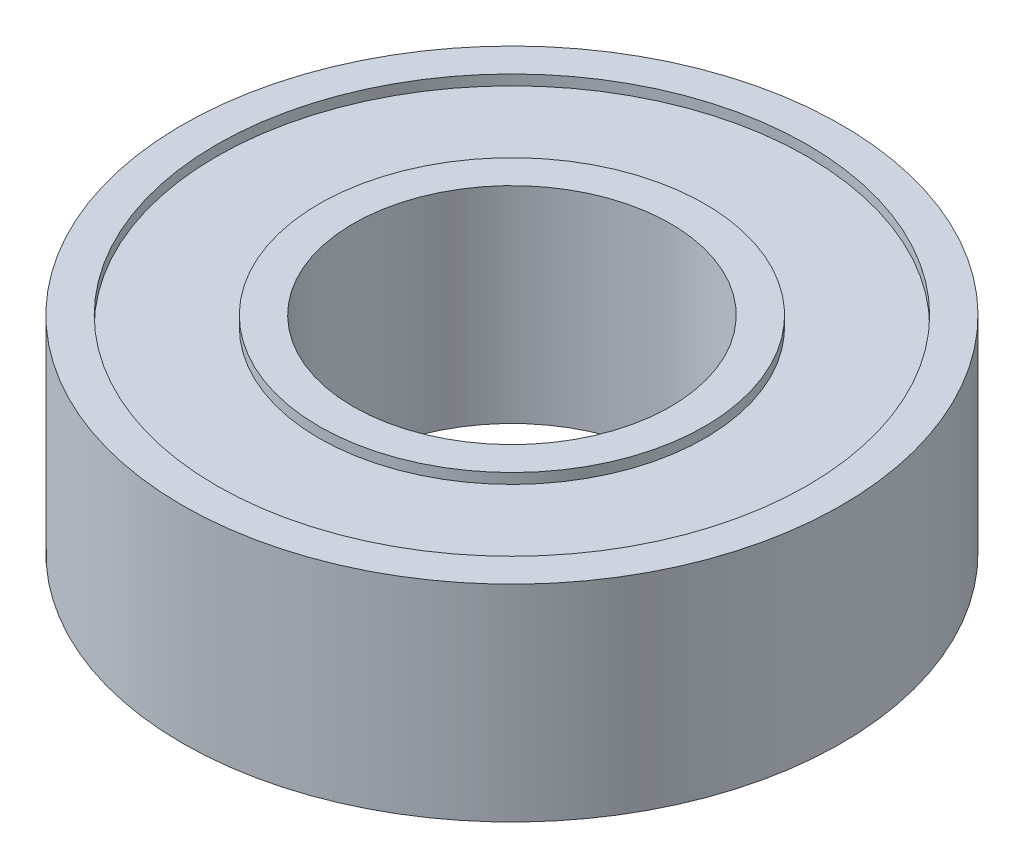
ISO-10303-21;
HEADER;
FILE_DESCRIPTION(('STEP AP214'),'2;1');
FILE_NAME('part.step','',(''),(''),'','','');
FILE_SCHEMA(('AUTOMOTIVE_DESIGN { 1 0 10303 214 1 1 1 1 }'));
ENDSEC;
DATA;
#1=APPLICATION_CONTEXT('core data for automotive mechanical design processes');
#2=APPLICATION_PROTOCOL_DEFINITION('international standard','automotive_design',2000,#1);
#3=PRODUCT_CONTEXT('',#1,'mechanical');
#4=PRODUCT('Part','Part','',(#3));
#5=PRODUCT_RELATED_PRODUCT_CATEGORY('part','',(#4));
#6=PRODUCT_DEFINITION_FORMATION('','',#4);
#7=PRODUCT_DEFINITION_CONTEXT('part definition',#1,'design');
#8=PRODUCT_DEFINITION('design','',#6,#7);
#9=PRODUCT_DEFINITION_SHAPE('','',#8);
#10=(LENGTH_UNIT() NAMED_UNIT(*) SI_UNIT(.MILLI.,.METRE.));
#11=(NAMED_UNIT(*) PLANE_ANGLE_UNIT() SI_UNIT($,.RADIAN.));
#12=(NAMED_UNIT(*) SI_UNIT($,.STERADIAN.) SOLID_ANGLE_UNIT());
#13=UNCERTAINTY_MEASURE_WITH_UNIT(LENGTH_MEASURE(1.E-05),#10,'distance_accuracy_value','');
#14=(GEOMETRIC_REPRESENTATION_CONTEXT(3) GLOBAL_UNCERTAINTY_ASSIGNED_CONTEXT((#13)) GLOBAL_UNIT_ASSIGNED_CONTEXT((#10,
#11,#12)) REPRESENTATION_CONTEXT('',''));
#15=CARTESIAN_POINT('',(0.,0.,0.));
#16=DIRECTION('',(0.,0.,1.));
#17=DIRECTION('',(1.,0.,0.));
#18=AXIS2_PLACEMENT_3D('',#15,#16,#17);
#19=CARTESIAN_POINT('',(0.,-2.5,0.));
#20=DIRECTION('',(0.,1.,0.));
#21=DIRECTION('',(0.,0.,1.));
#22=AXIS2_PLACEMENT_3D('',#19,#20,#21);
#23=PLANE('',#22);
#24=CARTESIAN_POINT('',(0.,-2.5,0.));
#25=DIRECTION('',(0.,1.,0.));
#26=DIRECTION('',(0.,0.,1.));
#27=AXIS2_PLACEMENT_3D('',#24,#25,#26);
#28=CIRCLE('',#27,3.85);
#29=CARTESIAN_POINT('',(0.,-2.5,3.85));
#30=VERTEX_POINT('',#29);
#31=EDGE_CURVE('E48',#30,#30,#28,.T.);
#32=ORIENTED_EDGE('',*,*,#31,.T.);
#33=EDGE_LOOP('',(#32));
#34=FACE_BOUND('',#33,.T.);
#35=CARTESIAN_POINT('',(0.,-2.5,0.));
#36=DIRECTION('',(0.,1.,0.));
#37=DIRECTION('',(0.,0.,1.));
#38=AXIS2_PLACEMENT_3D('',#35,#36,#37);
#39=CIRCLE('',#38,4.68);
#40=CARTESIAN_POINT('',(0.,-2.5,4.68));
#41=VERTEX_POINT('',#40);
#42=EDGE_CURVE('E72',#41,#41,#39,.T.);
#43=ORIENTED_EDGE('',*,*,#42,.F.);
#44=EDGE_LOOP('',(#43));
#45=FACE_BOUND('',#44,.T.);
#46=ADVANCED_FACE('F35',(#34,#45),#23,.F.);
#47=CARTESIAN_POINT('',(0.,2.5,0.));
#48=DIRECTION('',(0.,1.,0.));
#49=DIRECTION('',(0.,0.,1.));
#50=AXIS2_PLACEMENT_3D('',#47,#48,#49);
#51=PLANE('',#50);
#52=CARTESIAN_POINT('',(0.,2.5,0.));
#53=DIRECTION('',(0.,1.,0.));
#54=DIRECTION('',(0.,0.,1.));
#55=AXIS2_PLACEMENT_3D('',#52,#53,#54);
#56=CIRCLE('',#55,3.85);
#57=CARTESIAN_POINT('',(0.,2.5,3.85));
#58=VERTEX_POINT('',#57);
#59=EDGE_CURVE('E46',#58,#58,#56,.T.);
#60=ORIENTED_EDGE('',*,*,#59,.F.);
#61=EDGE_LOOP('',(#60));
#62=FACE_BOUND('',#61,.T.);
#63=CARTESIAN_POINT('',(0.,2.5,0.));
#64=DIRECTION('',(0.,1.,0.));
#65=DIRECTION('',(0.,0.,1.));
#66=AXIS2_PLACEMENT_3D('',#63,#64,#65);
#67=CIRCLE('',#66,4.68);
#68=CARTESIAN_POINT('',(0.,2.5,4.68));
#69=VERTEX_POINT('',#68);
#70=EDGE_CURVE('E60',#69,#69,#67,.T.);
#71=ORIENTED_EDGE('',*,*,#70,.T.);
#72=EDGE_LOOP('',(#71));
#73=FACE_BOUND('',#72,.T.);
#74=ADVANCED_FACE('F88',(#62,#73),#51,.T.);
#75=CARTESIAN_POINT('',(0.,2.5,0.));
#76=DIRECTION('',(0.,1.,0.));
#77=DIRECTION('',(0.,0.,1.));
#78=AXIS2_PLACEMENT_3D('',#75,#76,#77);
#79=CIRCLE('',#78,7.17);
#80=CARTESIAN_POINT('',(0.,2.5,7.17));
#81=VERTEX_POINT('',#80);
#82=EDGE_CURVE('E54',#81,#81,#79,.T.);
#83=ORIENTED_EDGE('',*,*,#82,.F.);
#84=EDGE_LOOP('',(#83));
#85=FACE_BOUND('',#84,.T.);
#86=CARTESIAN_POINT('',(0.,2.5,0.));
#87=DIRECTION('',(0.,1.,0.));
#88=DIRECTION('',(0.,0.,1.));
#89=AXIS2_PLACEMENT_3D('',#86,#87,#88);
#90=CIRCLE('',#89,8.);
#91=CARTESIAN_POINT('',(0.,2.5,8.));
#92=VERTEX_POINT('',#91);
#93=EDGE_CURVE('E10',#92,#92,#90,.T.);
#94=ORIENTED_EDGE('',*,*,#93,.T.);
#95=EDGE_LOOP('',(#94));
#96=FACE_BOUND('',#95,.T.);
#97=ADVANCED_FACE('F94',(#85,#96),#51,.T.);
#98=CARTESIAN_POINT('',(0.,-2.5,0.));
#99=DIRECTION('',(0.,1.,0.));
#100=DIRECTION('',(0.,0.,1.));
#101=AXIS2_PLACEMENT_3D('',#98,#99,#100);
#102=CIRCLE('',#101,7.17);
#103=CARTESIAN_POINT('',(0.,-2.5,7.17));
#104=VERTEX_POINT('',#103);
#105=EDGE_CURVE('E66',#104,#104,#102,.T.);
#106=ORIENTED_EDGE('',*,*,#105,.T.);
#107=EDGE_LOOP('',(#106));
#108=FACE_BOUND('',#107,.T.);
#109=CARTESIAN_POINT('',(0.,-2.5,0.));
#110=DIRECTION('',(0.,1.,0.));
#111=DIRECTION('',(0.,0.,1.));
#112=AXIS2_PLACEMENT_3D('',#109,#110,#111);
#113=CIRCLE('',#112,8.);
#114=CARTESIAN_POINT('',(0.,-2.5,8.));
#115=VERTEX_POINT('',#114);
#116=EDGE_CURVE('E39',#115,#115,#113,.T.);
#117=ORIENTED_EDGE('',*,*,#116,.F.);
#118=EDGE_LOOP('',(#117));
#119=FACE_BOUND('',#118,.T.);
#120=ADVANCED_FACE('F90',(#108,#119),#23,.F.);
#121=CARTESIAN_POINT('',(0.,2.5,0.));
#122=DIRECTION('',(0.,-1.,0.));
#123=DIRECTION('',(0.,0.,-1.));
#124=AXIS2_PLACEMENT_3D('',#121,#122,#123);
#125=CYLINDRICAL_SURFACE('',#124,8.);
#126=ORIENTED_EDGE('',*,*,#93,.F.);
#127=EDGE_LOOP('',(#126));
#128=FACE_BOUND('',#127,.T.);
#129=ORIENTED_EDGE('',*,*,#116,.T.);
#130=EDGE_LOOP('',(#129));
#131=FACE_BOUND('',#130,.T.);
#132=ADVANCED_FACE('F37',(#128,#131),#125,.T.);
#133=CARTESIAN_POINT('',(0.,2.5,0.));
#134=DIRECTION('',(0.,-1.,0.));
#135=DIRECTION('',(0.,0.,-1.));
#136=AXIS2_PLACEMENT_3D('',#133,#134,#135);
#137=CYLINDRICAL_SURFACE('',#136,3.85);
#138=ORIENTED_EDGE('',*,*,#59,.T.);
#139=EDGE_LOOP('',(#138));
#140=FACE_BOUND('',#139,.T.);
#141=ORIENTED_EDGE('',*,*,#31,.F.);
#142=EDGE_LOOP('',(#141));
#143=FACE_BOUND('',#142,.T.);
#144=ADVANCED_FACE('F103',(#140,#143),#137,.F.);
#145=CARTESIAN_POINT('',(0.,2.25,0.));
#146=DIRECTION('',(0.,1.,0.));
#147=DIRECTION('',(0.,0.,1.));
#148=AXIS2_PLACEMENT_3D('',#145,#146,#147);
#149=CYLINDRICAL_SURFACE('',#148,7.17);
#150=CARTESIAN_POINT('',(0.,2.25,0.));
#151=DIRECTION('',(0.,1.,0.));
#152=DIRECTION('',(0.,0.,1.));
#153=AXIS2_PLACEMENT_3D('',#150,#151,#152);
#154=CIRCLE('',#153,7.17);
#155=CARTESIAN_POINT('',(0.,2.25,7.17));
#156=VERTEX_POINT('',#155);
#157=EDGE_CURVE('E51',#156,#156,#154,.T.);
#158=ORIENTED_EDGE('',*,*,#157,.F.);
#159=EDGE_LOOP('',(#158));
#160=FACE_BOUND('',#159,.T.);
#161=ORIENTED_EDGE('',*,*,#82,.T.);
#162=EDGE_LOOP('',(#161));
#163=FACE_BOUND('',#162,.T.);
#164=ADVANCED_FACE('F127',(#160,#163),#149,.F.);
#165=CARTESIAN_POINT('',(0.,2.25,0.));
#166=DIRECTION('',(0.,1.,0.));
#167=DIRECTION('',(0.,0.,1.));
#168=AXIS2_PLACEMENT_3D('',#165,#166,#167);
#169=PLANE('',#168);
#170=CARTESIAN_POINT('',(0.,2.25,0.));
#171=DIRECTION('',(0.,1.,0.));
#172=DIRECTION('',(0.,0.,1.));
#173=AXIS2_PLACEMENT_3D('',#170,#171,#172);
#174=CIRCLE('',#173,4.68);
#175=CARTESIAN_POINT('',(0.,2.25,4.68));
#176=VERTEX_POINT('',#175);
#177=EDGE_CURVE('E57',#176,#176,#174,.T.);
#178=ORIENTED_EDGE('',*,*,#177,.F.);
#179=EDGE_LOOP('',(#178));
#180=FACE_BOUND('',#179,.T.);
#181=ORIENTED_EDGE('',*,*,#157,.T.);
#182=EDGE_LOOP('',(#181));
#183=FACE_BOUND('',#182,.T.);
#184=ADVANCED_FACE('F123',(#180,#183),#169,.T.);
#185=CARTESIAN_POINT('',(0.,2.25,0.));
#186=DIRECTION('',(0.,1.,0.));
#187=DIRECTION('',(0.,0.,1.));
#188=AXIS2_PLACEMENT_3D('',#185,#186,#187);
#189=CYLINDRICAL_SURFACE('',#188,4.68);
#190=ORIENTED_EDGE('',*,*,#177,.T.);
#191=EDGE_LOOP('',(#190));
#192=FACE_BOUND('',#191,.T.);
#193=ORIENTED_EDGE('',*,*,#70,.F.);
#194=EDGE_LOOP('',(#193));
#195=FACE_BOUND('',#194,.T.);
#196=ADVANCED_FACE('F117',(#192,#195),#189,.T.);
#197=CARTESIAN_POINT('',(0.,-2.25,0.));
#198=DIRECTION('',(0.,-1.,0.));
#199=DIRECTION('',(0.,0.,1.));
#200=AXIS2_PLACEMENT_3D('',#197,#198,#199);
#201=PLANE('',#200);
#202=CARTESIAN_POINT('',(0.,-2.25,0.));
#203=DIRECTION('',(0.,1.,0.));
#204=DIRECTION('',(0.,0.,1.));
#205=AXIS2_PLACEMENT_3D('',#202,#203,#204);
#206=CIRCLE('',#205,7.17);
#207=CARTESIAN_POINT('',(0.,-2.25,7.17));
#208=VERTEX_POINT('',#207);
#209=EDGE_CURVE('E63',#208,#208,#206,.T.);
#210=ORIENTED_EDGE('',*,*,#209,.F.);
#211=EDGE_LOOP('',(#210));
#212=FACE_BOUND('',#211,.T.);
#213=CARTESIAN_POINT('',(0.,-2.25,0.));
#214=DIRECTION('',(0.,1.,0.));
#215=DIRECTION('',(0.,0.,1.));
#216=AXIS2_PLACEMENT_3D('',#213,#214,#215);
#217=CIRCLE('',#216,4.68);
#218=CARTESIAN_POINT('',(0.,-2.25,4.68));
#219=VERTEX_POINT('',#218);
#220=EDGE_CURVE('E69',#219,#219,#217,.T.);
#221=ORIENTED_EDGE('',*,*,#220,.T.);
#222=EDGE_LOOP('',(#221));
#223=FACE_BOUND('',#222,.T.);
#224=ADVANCED_FACE('F78',(#212,#223),#201,.T.);
#225=CARTESIAN_POINT('',(0.,-2.25,0.));
#226=DIRECTION('',(0.,-1.,0.));
#227=DIRECTION('',(0.,0.,-1.));
#228=AXIS2_PLACEMENT_3D('',#225,#226,#227);
#229=CYLINDRICAL_SURFACE('',#228,7.17);
#230=ORIENTED_EDGE('',*,*,#209,.T.);
#231=EDGE_LOOP('',(#230));
#232=FACE_BOUND('',#231,.T.);
#233=ORIENTED_EDGE('',*,*,#105,.F.);
#234=EDGE_LOOP('',(#233));
#235=FACE_BOUND('',#234,.T.);
#236=ADVANCED_FACE('F83',(#232,#235),#229,.F.);
#237=CARTESIAN_POINT('',(0.,-2.25,0.));
#238=DIRECTION('',(0.,-1.,0.));
#239=DIRECTION('',(0.,0.,-1.));
#240=AXIS2_PLACEMENT_3D('',#237,#238,#239);
#241=CYLINDRICAL_SURFACE('',#240,4.68);
#242=ORIENTED_EDGE('',*,*,#220,.F.);
#243=EDGE_LOOP('',(#242));
#244=FACE_BOUND('',#243,.T.);
#245=ORIENTED_EDGE('',*,*,#42,.T.);
#246=EDGE_LOOP('',(#245));
#247=FACE_BOUND('',#246,.T.);
#248=ADVANCED_FACE('F80',(#244,#247),#241,.T.);
#249=CLOSED_SHELL('',(#46,#74,#97,#120,#132,#144,#164,#184,#196,#224,#236,#248));
#250=MANIFOLD_SOLID_BREP('B2',#249);
#251=ADVANCED_BREP_SHAPE_REPRESENTATION('',(#18,#250),#14);
#252=SHAPE_DEFINITION_REPRESENTATION(#9,#251);
ENDSEC;
END-ISO-10303-21;
